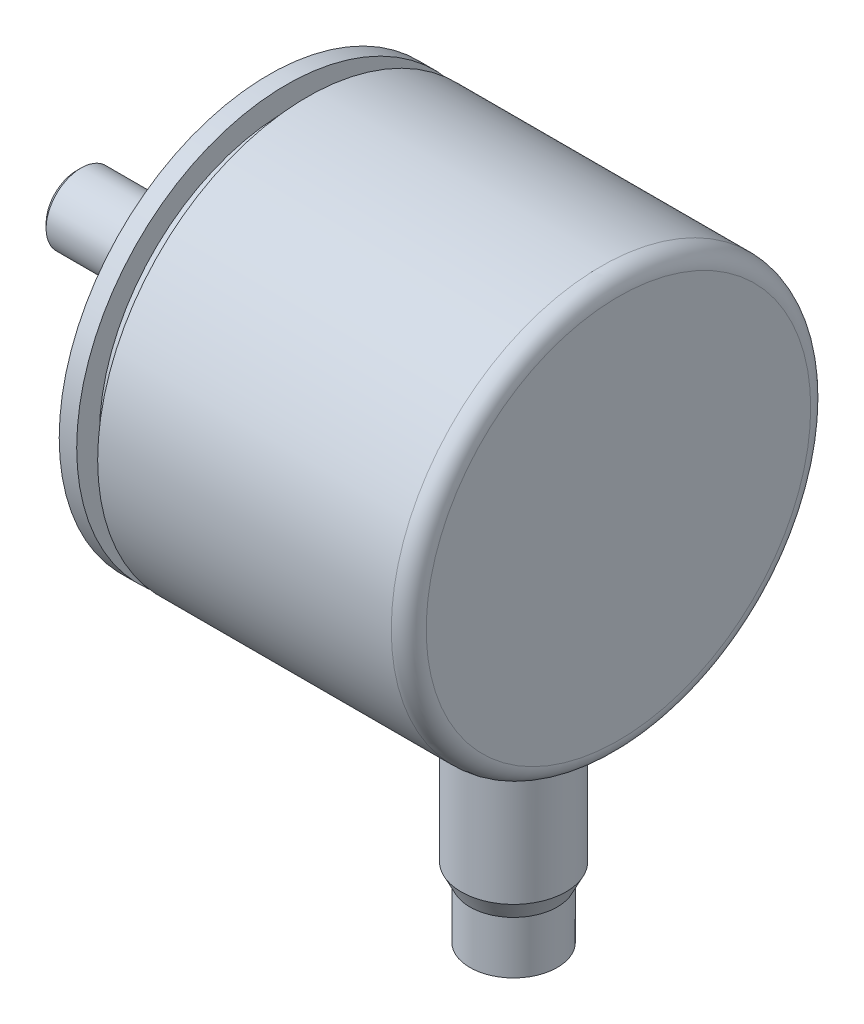
ISO-10303-21;
HEADER;
FILE_DESCRIPTION(('STEP AP214'),'2;1');
FILE_NAME('part.step','',(''),(''),'','','');
FILE_SCHEMA(('AUTOMOTIVE_DESIGN { 1 0 10303 214 1 1 1 1 }'));
ENDSEC;
DATA;
#1=APPLICATION_CONTEXT('core data for automotive mechanical design processes');
#2=APPLICATION_PROTOCOL_DEFINITION('international standard','automotive_design',2000,#1);
#3=PRODUCT_CONTEXT('',#1,'mechanical');
#4=PRODUCT('Part','Part','',(#3));
#5=PRODUCT_RELATED_PRODUCT_CATEGORY('part','',(#4));
#6=PRODUCT_DEFINITION_FORMATION('','',#4);
#7=PRODUCT_DEFINITION_CONTEXT('part definition',#1,'design');
#8=PRODUCT_DEFINITION('design','',#6,#7);
#9=PRODUCT_DEFINITION_SHAPE('','',#8);
#10=(LENGTH_UNIT() NAMED_UNIT(*) SI_UNIT(.MILLI.,.METRE.));
#11=(NAMED_UNIT(*) PLANE_ANGLE_UNIT() SI_UNIT($,.RADIAN.));
#12=(NAMED_UNIT(*) SI_UNIT($,.STERADIAN.) SOLID_ANGLE_UNIT());
#13=UNCERTAINTY_MEASURE_WITH_UNIT(LENGTH_MEASURE(1.E-05),#10,'distance_accuracy_value','');
#14=(GEOMETRIC_REPRESENTATION_CONTEXT(3) GLOBAL_UNCERTAINTY_ASSIGNED_CONTEXT((#13)) GLOBAL_UNIT_ASSIGNED_CONTEXT((#10,
#11,#12)) REPRESENTATION_CONTEXT('',''));
#15=CARTESIAN_POINT('',(0.,0.,0.));
#16=DIRECTION('',(0.,0.,1.));
#17=DIRECTION('',(1.,0.,0.));
#18=AXIS2_PLACEMENT_3D('',#15,#16,#17);
#19=CARTESIAN_POINT('',(25.,-13.,0.));
#20=DIRECTION('',(0.,1.,0.));
#21=DIRECTION('',(0.,0.,1.));
#22=AXIS2_PLACEMENT_3D('',#19,#20,#21);
#23=CYLINDRICAL_SURFACE('',#22,4.);
#24=CARTESIAN_POINT('',(25.,-11.3137084989848,4.));
#25=CARTESIAN_POINT('',(24.7821273006557,-11.3137077812174,4.00000103179085));
#26=CARTESIAN_POINT('',(24.5642608007056,-11.3200707716343,3.98213913474209));
#27=CARTESIAN_POINT('',(24.134982316023,-11.3447029632502,3.91140452675523));
#28=CARTESIAN_POINT('',(23.9235714005101,-11.3629741256876,3.85852604867359));
#29=CARTESIAN_POINT('',(23.5134924280108,-11.4091281475517,3.71982194273962));
#30=CARTESIAN_POINT('',(23.3148002822291,-11.4369921588529,3.63406088561298));
#31=CARTESIAN_POINT('',(22.9345598058082,-11.499164880413,3.43224651376552));
#32=CARTESIAN_POINT('',(22.7530152697855,-11.5334750121445,3.31618651544073));
#33=CARTESIAN_POINT('',(22.4051201506467,-11.6061795762989,3.05220458577151));
#34=CARTESIAN_POINT('',(22.2395382853131,-11.6446757937858,2.90329736551167));
#35=CARTESIAN_POINT('',(21.9351727951014,-11.7205545920401,2.57995066885758));
#36=CARTESIAN_POINT('',(21.7963934736705,-11.7579369931585,2.4055071002095));
#37=CARTESIAN_POINT('',(21.5460844106816,-11.828554676872,2.03041803186004));
#38=CARTESIAN_POINT('',(21.4353601175282,-11.8616563080642,1.8292076448981));
#39=CARTESIAN_POINT('',(21.24963365949,-11.9187834708393,1.40972489194989));
#40=CARTESIAN_POINT('',(21.1746218672924,-11.9428114481201,1.19145714274884));
#41=CARTESIAN_POINT('',(21.0650565814704,-11.9783630172763,0.752115269733972));
#42=CARTESIAN_POINT('',(21.029186214972,-11.9902925911024,0.531403019411868));
#43=CARTESIAN_POINT('',(20.9947348265574,-12.0017443287299,0.0867914992963533));
#44=CARTESIAN_POINT('',(20.9961441933904,-12.0012696905158,-0.13710693417559));
#45=CARTESIAN_POINT('',(21.0353770182641,-11.9882415847493,-0.572414060775262));
#46=CARTESIAN_POINT('',(21.071770113898,-11.9761625902047,-0.78396819436663));
#47=CARTESIAN_POINT('',(21.1775719239219,-11.9418786935893,-1.19777375528869));
#48=CARTESIAN_POINT('',(21.2469828759193,-11.9196731052473,-1.40002455111687));
#49=CARTESIAN_POINT('',(21.4176852692242,-11.867026811729,-1.7926098993679));
#50=CARTESIAN_POINT('',(21.5193837541861,-11.8364817009606,-1.98275288387538));
#51=CARTESIAN_POINT('',(21.7514388217946,-11.7703357215568,-2.34369730210929));
#52=CARTESIAN_POINT('',(21.8818033733105,-11.7347334480587,-2.51449333754137));
#53=CARTESIAN_POINT('',(22.1746975738388,-11.6602476739959,-2.84040346620523));
#54=CARTESIAN_POINT('',(22.3384526313659,-11.6212886067551,-2.99440062826109));
#55=CARTESIAN_POINT('',(22.6897949029065,-11.545893409956,-3.2731090383927));
#56=CARTESIAN_POINT('',(22.8773857829122,-11.5094576698246,-3.39781577312617));
#57=CARTESIAN_POINT('',(23.2746145024138,-11.4428210048445,-3.61594982014297));
#58=CARTESIAN_POINT('',(23.4845285252711,-11.4127163713899,-3.70890585448536));
#59=CARTESIAN_POINT('',(23.9182855768577,-11.3632660329754,-3.85777277307735));
#60=CARTESIAN_POINT('',(24.142122724825,-11.3439158194837,-3.91369918298997));
#61=CARTESIAN_POINT('',(24.5865534216463,-11.3191854526234,-3.98464512839009));
#62=CARTESIAN_POINT('',(24.8068376989946,-11.3132144127502,-4.00139638203053));
#63=CARTESIAN_POINT('',(25.2471045964564,-11.3142668823674,-3.99842175563887));
#64=CARTESIAN_POINT('',(25.467087264096,-11.3212880316726,-3.97870250090705));
#65=CARTESIAN_POINT('',(25.8926278628476,-11.346944723612,-3.90490260620924));
#66=CARTESIAN_POINT('',(26.0984217206034,-11.3651730176336,-3.85202557592273));
#67=CARTESIAN_POINT('',(26.4981744249567,-11.4107421468409,-3.71485545024187));
#68=CARTESIAN_POINT('',(26.6921311663631,-11.4380845973936,-3.63055678545369));
#69=CARTESIAN_POINT('',(27.069521683388,-11.4998751038315,-3.42989736295574));
#70=CARTESIAN_POINT('',(27.2524265705672,-11.5345210266251,-3.31260447343398));
#71=CARTESIAN_POINT('',(27.5965842095349,-11.6066307492386,-3.05034252223023));
#72=CARTESIAN_POINT('',(27.7578305546449,-11.6440953777518,-2.90536530199512));
#73=CARTESIAN_POINT('',(28.0621119363626,-11.719801545514,-2.5835668236013));
#74=CARTESIAN_POINT('',(28.2038975600754,-11.7579937431159,-2.4055490821866));
#75=CARTESIAN_POINT('',(28.4556645693922,-11.8290740645244,-2.02730916560102));
#76=CARTESIAN_POINT('',(28.5656470846497,-11.8619623767078,-1.82708777945821));
#77=CARTESIAN_POINT('',(28.7496804194469,-11.9185762324241,-1.41111944972918));
#78=CARTESIAN_POINT('',(28.8239651085923,-11.9423612001812,-1.19548449328478));
#79=CARTESIAN_POINT('',(28.9349109682404,-11.978344433511,-0.753833863384064));
#80=CARTESIAN_POINT('',(28.971585719522,-11.9905468813608,-0.527821967815556));
#81=CARTESIAN_POINT('',(29.0050483104226,-12.0016745294503,-0.0832613434401611));
#82=CARTESIAN_POINT('',(29.0036298157295,-12.0011968035776,0.135138895680077));
#83=CARTESIAN_POINT('',(28.9653707674144,-11.9884878607759,0.568444580000699));
#84=CARTESIAN_POINT('',(28.9285330873889,-11.976257597343,0.783350307276231));
#85=CARTESIAN_POINT('',(28.8216710616962,-11.9416365981765,1.20016847772824));
#86=CARTESIAN_POINT('',(28.7521831385883,-11.9194103344459,1.40223308365116));
#87=CARTESIAN_POINT('',(28.5824898756114,-11.8670864281798,1.79191340375918));
#88=CARTESIAN_POINT('',(28.4822789792119,-11.8369873619207,1.97952649656973));
#89=CARTESIAN_POINT('',(28.249721951592,-11.7706347531152,2.34253606523514));
#90=CARTESIAN_POINT('',(28.1163252584734,-11.7341948996771,2.51722500623043));
#91=CARTESIAN_POINT('',(27.8229704353752,-11.6597195516752,2.84232410508971));
#92=CARTESIAN_POINT('',(27.6630038309491,-11.6216835509239,2.99272648649837));
#93=CARTESIAN_POINT('',(27.3135625776522,-11.5465311930239,3.27096723533247));
#94=CARTESIAN_POINT('',(27.1231779560934,-11.5095091195452,3.3976918639916));
#95=CARTESIAN_POINT('',(26.7226622923889,-11.4424077329206,3.61725737320446));
#96=CARTESIAN_POINT('',(26.5125364278813,-11.41232660645,3.7101071072779));
#97=CARTESIAN_POINT('',(26.0881527039375,-11.3640533682606,3.85537531281666));
#98=CARTESIAN_POINT('',(25.8745109458985,-11.3453853142873,3.90943163659808));
#99=CARTESIAN_POINT('',(25.4405757981332,-11.3202153415807,3.98173728059707));
#100=CARTESIAN_POINT('',(25.2202847303572,-11.3137092246984,3.99999895678637));
#101=CARTESIAN_POINT('',(25.,-11.3137084989848,4.));
#102=B_SPLINE_CURVE_WITH_KNOTS('',3,(#24,#25,#26,#27,#28,#29,#30,#31,#32,#33,#34,#35,#36,#37,
#38,#39,#40,#41,#42,#43,#44,#45,#46,#47,#48,#49,#50,#51,#52,#53,#54,#55,#56,#57,#58,#59,#60,#61,
#62,#63,#64,#65,#66,#67,#68,#69,#70,#71,#72,#73,#74,#75,#76,#77,#78,#79,#80,#81,#82,#83,#84,#85,
#86,#87,#88,#89,#90,#91,#92,#93,#94,#95,#96,#97,#98,#99,#100,#101),.UNSPECIFIED.,.T.,.F.,(4,2,2,
2,2,2,2,2,2,2,2,2,2,2,2,2,2,2,2,2,2,2,2,2,2,2,2,2,2,2,2,2,2,2,2,2,2,2,4),(0.,0.652802339197421,
1.30571222006066,1.95734651000331,2.60912466474177,3.28405349710273,3.95909060687952,
4.65174024574629,5.34420305547157,6.01257275059737,6.68077013209309,7.32276019302276,
7.96479376756947,8.6152661944134,9.26591967496088,9.94720697455671,10.6285991844842,
11.3197055937222,12.0105220542646,12.6701716545776,13.3297014334894,13.966575830751,
14.6035631658778,15.2607543094286,15.9181394264851,16.6071523268437,17.2961407503013,
17.9805516476341,18.6647153201663,19.3167233871054,19.9686785603912,20.6102782416172,
21.2519940305297,21.9174207808253,22.5830601773053,23.2747561094458,23.9662711306747,
24.6265284865076,25.2865578876185),.UNSPECIFIED.);
#103=CARTESIAN_POINT('',(21.,-12.,0.));
#104=VERTEX_POINT('',#103);
#105=CARTESIAN_POINT('',(29.0000000000011,-12.0000000000004,0.));
#106=VERTEX_POINT('',#105);
#107=EDGE_CURVE('E137',#104,#106,#102,.T.);
#108=ORIENTED_EDGE('',*,*,#107,.T.);
#109=CARTESIAN_POINT('',(25.,-12.,0.));
#110=DIRECTION('',(0.,1.,0.));
#111=DIRECTION('',(0.,0.,1.));
#112=AXIS2_PLACEMENT_3D('',#109,#110,#111);
#113=CIRCLE('',#112,4.);
#114=EDGE_CURVE('E46',#106,#104,#113,.T.);
#115=ORIENTED_EDGE('',*,*,#114,.T.);
#116=EDGE_LOOP('',(#108,#115));
#117=FACE_BOUND('',#116,.T.);
#118=ADVANCED_FACE('F38',(#117),#23,.T.);
#119=CARTESIAN_POINT('',(0.,0.,0.));
#120=DIRECTION('',(-1.,0.,0.));
#121=DIRECTION('',(0.,0.,1.));
#122=AXIS2_PLACEMENT_3D('',#119,#120,#121);
#123=PLANE('',#122);
#124=CARTESIAN_POINT('',(0.,0.,0.));
#125=DIRECTION('',(-1.,0.,0.));
#126=DIRECTION('',(0.,0.,1.));
#127=AXIS2_PLACEMENT_3D('',#124,#125,#126);
#128=CIRCLE('',#127,1.75);
#129=CARTESIAN_POINT('',(0.,0.,1.75));
#130=VERTEX_POINT('',#129);
#131=EDGE_CURVE('E127',#130,#130,#128,.T.);
#132=ORIENTED_EDGE('',*,*,#131,.T.);
#133=EDGE_LOOP('',(#132));
#134=FACE_BOUND('',#133,.T.);
#135=ADVANCED_FACE('F171',(#134),#123,.T.);
#136=CARTESIAN_POINT('',(0.,0.,0.));
#137=DIRECTION('',(1.,0.,0.));
#138=DIRECTION('',(0.,0.,-1.));
#139=AXIS2_PLACEMENT_3D('',#136,#137,#138);
#140=CYLINDRICAL_SURFACE('',#139,2.);
#141=CARTESIAN_POINT('',(0.250000000000002,0.,0.));
#142=DIRECTION('',(-1.,0.,0.));
#143=DIRECTION('',(0.,0.,1.));
#144=AXIS2_PLACEMENT_3D('',#141,#142,#143);
#145=CIRCLE('',#144,2.);
#146=CARTESIAN_POINT('',(0.250000000000002,0.,2.));
#147=VERTEX_POINT('',#146);
#148=EDGE_CURVE('E124',#147,#147,#145,.F.);
#149=ORIENTED_EDGE('',*,*,#148,.T.);
#150=EDGE_LOOP('',(#149));
#151=FACE_BOUND('',#150,.T.);
#152=CARTESIAN_POINT('',(10.,0.,0.));
#153=DIRECTION('',(1.,0.,0.));
#154=DIRECTION('',(0.,0.,-1.));
#155=AXIS2_PLACEMENT_3D('',#152,#153,#154);
#156=CIRCLE('',#155,2.);
#157=CARTESIAN_POINT('',(10.,0.,-2.));
#158=VERTEX_POINT('',#157);
#159=EDGE_CURVE('E121',#158,#158,#156,.T.);
#160=ORIENTED_EDGE('',*,*,#159,.F.);
#161=EDGE_LOOP('',(#160));
#162=FACE_BOUND('',#161,.T.);
#163=ADVANCED_FACE('F176',(#151,#162),#140,.T.);
#164=CARTESIAN_POINT('',(10.,2.,0.));
#165=DIRECTION('',(-1.,0.,0.));
#166=DIRECTION('',(0.,0.,1.));
#167=AXIS2_PLACEMENT_3D('',#164,#165,#166);
#168=PLANE('',#167);
#169=ORIENTED_EDGE('',*,*,#159,.T.);
#170=EDGE_LOOP('',(#169));
#171=FACE_BOUND('',#170,.T.);
#172=CARTESIAN_POINT('',(10.,0.,0.));
#173=DIRECTION('',(1.,0.,0.));
#174=DIRECTION('',(0.,0.,-1.));
#175=AXIS2_PLACEMENT_3D('',#172,#173,#174);
#176=CIRCLE('',#175,6.);
#177=CARTESIAN_POINT('',(10.,0.,-6.));
#178=VERTEX_POINT('',#177);
#179=EDGE_CURVE('E118',#178,#178,#176,.T.);
#180=ORIENTED_EDGE('',*,*,#179,.F.);
#181=EDGE_LOOP('',(#180));
#182=FACE_BOUND('',#181,.T.);
#183=ADVANCED_FACE('F202',(#171,#182),#168,.T.);
#184=CARTESIAN_POINT('',(0.,0.,0.));
#185=DIRECTION('',(1.,0.,0.));
#186=DIRECTION('',(0.,0.,-1.));
#187=AXIS2_PLACEMENT_3D('',#184,#185,#186);
#188=CYLINDRICAL_SURFACE('',#187,6.);
#189=ORIENTED_EDGE('',*,*,#179,.T.);
#190=EDGE_LOOP('',(#189));
#191=FACE_BOUND('',#190,.T.);
#192=CARTESIAN_POINT('',(11.,0.,0.));
#193=DIRECTION('',(1.,0.,0.));
#194=DIRECTION('',(0.,0.,-1.));
#195=AXIS2_PLACEMENT_3D('',#192,#193,#194);
#196=CIRCLE('',#195,6.);
#197=CARTESIAN_POINT('',(11.,0.,-6.));
#198=VERTEX_POINT('',#197);
#199=EDGE_CURVE('E115',#198,#198,#196,.T.);
#200=ORIENTED_EDGE('',*,*,#199,.F.);
#201=EDGE_LOOP('',(#200));
#202=FACE_BOUND('',#201,.T.);
#203=ADVANCED_FACE('F206',(#191,#202),#188,.T.);
#204=CARTESIAN_POINT('',(11.,6.,0.));
#205=DIRECTION('',(-1.,0.,0.));
#206=DIRECTION('',(0.,0.,1.));
#207=AXIS2_PLACEMENT_3D('',#204,#205,#206);
#208=PLANE('',#207);
#209=CARTESIAN_POINT('',(11.,9.,0.));
#210=DIRECTION('',(-1.,0.,0.));
#211=DIRECTION('',(0.,0.,1.));
#212=AXIS2_PLACEMENT_3D('',#209,#210,#211);
#213=CIRCLE('',#212,1.24999999999999);
#214=CARTESIAN_POINT('',(11.,9.,1.24999999999999));
#215=VERTEX_POINT('',#214);
#216=EDGE_CURVE('E78',#215,#215,#213,.T.);
#217=ORIENTED_EDGE('',*,*,#216,.F.);
#218=EDGE_LOOP('',(#217));
#219=FACE_BOUND('',#218,.T.);
#220=CARTESIAN_POINT('',(11.,-4.50000000000003,7.79422863405993));
#221=DIRECTION('',(-1.,0.,0.));
#222=DIRECTION('',(0.,0.,1.));
#223=AXIS2_PLACEMENT_3D('',#220,#221,#222);
#224=CIRCLE('',#223,1.24999999999999);
#225=CARTESIAN_POINT('',(11.,-4.50000000000003,9.04422863405992));
#226=VERTEX_POINT('',#225);
#227=EDGE_CURVE('E77',#226,#226,#224,.T.);
#228=ORIENTED_EDGE('',*,*,#227,.F.);
#229=EDGE_LOOP('',(#228));
#230=FACE_BOUND('',#229,.T.);
#231=CARTESIAN_POINT('',(11.,-4.49999999999998,-7.79422863405996));
#232=DIRECTION('',(-1.,0.,0.));
#233=DIRECTION('',(0.,0.,1.));
#234=AXIS2_PLACEMENT_3D('',#231,#232,#233);
#235=CIRCLE('',#234,1.24999999999999);
#236=CARTESIAN_POINT('',(11.,-4.49999999999998,-6.54422863405997));
#237=VERTEX_POINT('',#236);
#238=EDGE_CURVE('E88',#237,#237,#235,.T.);
#239=ORIENTED_EDGE('',*,*,#238,.F.);
#240=EDGE_LOOP('',(#239));
#241=FACE_BOUND('',#240,.T.);
#242=ORIENTED_EDGE('',*,*,#199,.T.);
#243=EDGE_LOOP('',(#242));
#244=FACE_BOUND('',#243,.T.);
#245=CARTESIAN_POINT('',(11.,0.,0.));
#246=DIRECTION('',(1.,0.,0.));
#247=DIRECTION('',(0.,0.,-1.));
#248=AXIS2_PLACEMENT_3D('',#245,#246,#247);
#249=CIRCLE('',#248,12.);
#250=CARTESIAN_POINT('',(11.,0.,-12.));
#251=VERTEX_POINT('',#250);
#252=EDGE_CURVE('E112',#251,#251,#249,.T.);
#253=ORIENTED_EDGE('',*,*,#252,.F.);
#254=EDGE_LOOP('',(#253));
#255=FACE_BOUND('',#254,.T.);
#256=ADVANCED_FACE('F210',(#219,#230,#241,#244,#255),#208,.T.);
#257=CARTESIAN_POINT('',(0.,0.,0.));
#258=DIRECTION('',(1.,0.,0.));
#259=DIRECTION('',(0.,0.,-1.));
#260=AXIS2_PLACEMENT_3D('',#257,#258,#259);
#261=CYLINDRICAL_SURFACE('',#260,12.);
#262=ORIENTED_EDGE('',*,*,#252,.T.);
#263=EDGE_LOOP('',(#262));
#264=FACE_BOUND('',#263,.T.);
#265=CARTESIAN_POINT('',(12.,0.,0.));
#266=DIRECTION('',(1.,0.,0.));
#267=DIRECTION('',(0.,0.,-1.));
#268=AXIS2_PLACEMENT_3D('',#265,#266,#267);
#269=CIRCLE('',#268,12.);
#270=CARTESIAN_POINT('',(12.,0.,-12.));
#271=VERTEX_POINT('',#270);
#272=EDGE_CURVE('E109',#271,#271,#269,.T.);
#273=ORIENTED_EDGE('',*,*,#272,.F.);
#274=EDGE_LOOP('',(#273));
#275=FACE_BOUND('',#274,.T.);
#276=ADVANCED_FACE('F214',(#264,#275),#261,.T.);
#277=CARTESIAN_POINT('',(12.,12.,0.));
#278=DIRECTION('',(1.,0.,0.));
#279=DIRECTION('',(0.,0.,-1.));
#280=AXIS2_PLACEMENT_3D('',#277,#278,#279);
#281=PLANE('',#280);
#282=ORIENTED_EDGE('',*,*,#272,.T.);
#283=EDGE_LOOP('',(#282));
#284=FACE_BOUND('',#283,.T.);
#285=CARTESIAN_POINT('',(12.,0.,0.));
#286=DIRECTION('',(1.,0.,0.));
#287=DIRECTION('',(0.,0.,-1.));
#288=AXIS2_PLACEMENT_3D('',#285,#286,#287);
#289=CIRCLE('',#288,10.7);
#290=CARTESIAN_POINT('',(12.,0.,-10.7));
#291=VERTEX_POINT('',#290);
#292=EDGE_CURVE('E106',#291,#291,#289,.T.);
#293=ORIENTED_EDGE('',*,*,#292,.F.);
#294=EDGE_LOOP('',(#293));
#295=FACE_BOUND('',#294,.T.);
#296=ADVANCED_FACE('F218',(#284,#295),#281,.T.);
#297=CARTESIAN_POINT('',(0.,0.,0.));
#298=DIRECTION('',(1.,0.,0.));
#299=DIRECTION('',(0.,0.,-1.));
#300=AXIS2_PLACEMENT_3D('',#297,#298,#299);
#301=CYLINDRICAL_SURFACE('',#300,10.7);
#302=ORIENTED_EDGE('',*,*,#292,.T.);
#303=EDGE_LOOP('',(#302));
#304=FACE_BOUND('',#303,.T.);
#305=CARTESIAN_POINT('',(13.2,0.,0.));
#306=DIRECTION('',(1.,0.,0.));
#307=DIRECTION('',(0.,0.,-1.));
#308=AXIS2_PLACEMENT_3D('',#305,#306,#307);
#309=CIRCLE('',#308,10.7);
#310=CARTESIAN_POINT('',(13.2,0.,-10.7));
#311=VERTEX_POINT('',#310);
#312=EDGE_CURVE('E103',#311,#311,#309,.T.);
#313=ORIENTED_EDGE('',*,*,#312,.F.);
#314=EDGE_LOOP('',(#313));
#315=FACE_BOUND('',#314,.T.);
#316=ADVANCED_FACE('F222',(#304,#315),#301,.T.);
#317=CARTESIAN_POINT('',(13.2,10.7,0.));
#318=DIRECTION('',(-1.,0.,0.));
#319=DIRECTION('',(0.,0.,1.));
#320=AXIS2_PLACEMENT_3D('',#317,#318,#319);
#321=PLANE('',#320);
#322=ORIENTED_EDGE('',*,*,#312,.T.);
#323=EDGE_LOOP('',(#322));
#324=FACE_BOUND('',#323,.T.);
#325=CARTESIAN_POINT('',(13.2,0.,0.));
#326=DIRECTION('',(1.,0.,0.));
#327=DIRECTION('',(0.,0.,-1.));
#328=AXIS2_PLACEMENT_3D('',#325,#326,#327);
#329=CIRCLE('',#328,12.);
#330=CARTESIAN_POINT('',(13.2,0.,-12.));
#331=VERTEX_POINT('',#330);
#332=EDGE_CURVE('E98',#331,#331,#329,.T.);
#333=ORIENTED_EDGE('',*,*,#332,.F.);
#334=EDGE_LOOP('',(#333));
#335=FACE_BOUND('',#334,.T.);
#336=ADVANCED_FACE('F168',(#324,#335),#321,.T.);
#337=CARTESIAN_POINT('',(0.,0.,0.));
#338=DIRECTION('',(1.,0.,0.));
#339=DIRECTION('',(0.,0.,-1.));
#340=AXIS2_PLACEMENT_3D('',#337,#338,#339);
#341=CYLINDRICAL_SURFACE('',#340,12.);
#342=ORIENTED_EDGE('',*,*,#107,.F.);
#343=EDGE_CURVE('E136',#106,#104,#102,.T.);
#344=ORIENTED_EDGE('',*,*,#343,.F.);
#345=EDGE_LOOP('',(#342,#344));
#346=FACE_BOUND('',#345,.T.);
#347=CARTESIAN_POINT('',(30.,0.,0.));
#348=DIRECTION('',(1.,0.,0.));
#349=DIRECTION('',(0.,0.,-1.));
#350=AXIS2_PLACEMENT_3D('',#347,#348,#349);
#351=CIRCLE('',#350,12.);
#352=CARTESIAN_POINT('',(30.,0.,-12.));
#353=VERTEX_POINT('',#352);
#354=EDGE_CURVE('E133',#353,#353,#351,.F.);
#355=ORIENTED_EDGE('',*,*,#354,.T.);
#356=EDGE_LOOP('',(#355));
#357=FACE_BOUND('',#356,.T.);
#358=ORIENTED_EDGE('',*,*,#332,.T.);
#359=EDGE_LOOP('',(#358));
#360=FACE_BOUND('',#359,.T.);
#361=ADVANCED_FACE('F147',(#346,#357,#360),#341,.T.);
#362=CARTESIAN_POINT('',(31.,12.,0.));
#363=DIRECTION('',(1.,0.,0.));
#364=DIRECTION('',(0.,0.,-1.));
#365=AXIS2_PLACEMENT_3D('',#362,#363,#364);
#366=PLANE('',#365);
#367=CARTESIAN_POINT('',(31.,0.,0.));
#368=DIRECTION('',(1.,0.,0.));
#369=DIRECTION('',(0.,0.,-1.));
#370=AXIS2_PLACEMENT_3D('',#367,#368,#369);
#371=CIRCLE('',#370,11.);
#372=CARTESIAN_POINT('',(31.,0.,-11.));
#373=VERTEX_POINT('',#372);
#374=EDGE_CURVE('E130',#373,#373,#371,.T.);
#375=ORIENTED_EDGE('',*,*,#374,.T.);
#376=EDGE_LOOP('',(#375));
#377=FACE_BOUND('',#376,.T.);
#378=ADVANCED_FACE('F158',(#377),#366,.T.);
#379=CARTESIAN_POINT('',(0.250000000000002,0.,0.));
#380=DIRECTION('',(1.,0.,0.));
#381=DIRECTION('',(0.,0.,-1.));
#382=AXIS2_PLACEMENT_3D('',#379,#380,#381);
#383=CONICAL_SURFACE('',#382,2.,0.785398163397448);
#384=ORIENTED_EDGE('',*,*,#131,.F.);
#385=EDGE_LOOP('',(#384));
#386=FACE_BOUND('',#385,.T.);
#387=ORIENTED_EDGE('',*,*,#148,.F.);
#388=EDGE_LOOP('',(#387));
#389=FACE_BOUND('',#388,.T.);
#390=ADVANCED_FACE('F160',(#386,#389),#383,.T.);
#391=CARTESIAN_POINT('',(30.,0.,0.));
#392=DIRECTION('',(1.,0.,0.));
#393=DIRECTION('',(0.,0.,-1.));
#394=AXIS2_PLACEMENT_3D('',#391,#392,#393);
#395=TOROIDAL_SURFACE('',#394,11.,1.);
#396=ORIENTED_EDGE('',*,*,#354,.F.);
#397=EDGE_LOOP('',(#396));
#398=FACE_BOUND('',#397,.T.);
#399=ORIENTED_EDGE('',*,*,#374,.F.);
#400=EDGE_LOOP('',(#399));
#401=FACE_BOUND('',#400,.T.);
#402=ADVANCED_FACE('F156',(#398,#401),#395,.T.);
#403=ORIENTED_EDGE('',*,*,#343,.T.);
#404=CARTESIAN_POINT('',(25.,-12.,0.));
#405=DIRECTION('',(0.,1.,0.));
#406=DIRECTION('',(0.,0.,1.));
#407=AXIS2_PLACEMENT_3D('',#404,#405,#406);
#408=CIRCLE('',#407,4.);
#409=EDGE_CURVE('E52',#104,#106,#408,.T.);
#410=ORIENTED_EDGE('',*,*,#409,.T.);
#411=EDGE_LOOP('',(#403,#410));
#412=FACE_BOUND('',#411,.T.);
#413=ADVANCED_FACE('F151',(#412),#23,.T.);
#414=CARTESIAN_POINT('',(25.,-21.,0.));
#415=DIRECTION('',(0.,1.,0.));
#416=DIRECTION('',(0.,0.,1.));
#417=AXIS2_PLACEMENT_3D('',#414,#415,#416);
#418=CYLINDRICAL_SURFACE('',#417,3.);
#419=CARTESIAN_POINT('',(25.,-20.,0.));
#420=DIRECTION('',(0.,-1.,0.));
#421=DIRECTION('',(0.,0.,-1.));
#422=AXIS2_PLACEMENT_3D('',#419,#420,#421);
#423=CIRCLE('',#422,3.);
#424=CARTESIAN_POINT('',(25.,-20.,-3.));
#425=VERTEX_POINT('',#424);
#426=EDGE_CURVE('E11',#425,#425,#423,.F.);
#427=ORIENTED_EDGE('',*,*,#426,.T.);
#428=EDGE_LOOP('',(#427));
#429=FACE_BOUND('',#428,.T.);
#430=CARTESIAN_POINT('',(25.,-13.,0.));
#431=DIRECTION('',(0.,1.,0.));
#432=DIRECTION('',(0.,0.,1.));
#433=AXIS2_PLACEMENT_3D('',#430,#431,#432);
#434=CIRCLE('',#433,3.);
#435=CARTESIAN_POINT('',(25.,-13.,3.));
#436=VERTEX_POINT('',#435);
#437=EDGE_CURVE('E145',#436,#436,#434,.F.);
#438=ORIENTED_EDGE('',*,*,#437,.T.);
#439=EDGE_LOOP('',(#438));
#440=FACE_BOUND('',#439,.T.);
#441=ADVANCED_FACE('F155',(#429,#440),#418,.T.);
#442=CARTESIAN_POINT('',(25.,-24.,0.));
#443=DIRECTION('',(0.,1.,0.));
#444=DIRECTION('',(0.,0.,1.));
#445=AXIS2_PLACEMENT_3D('',#442,#443,#444);
#446=CYLINDRICAL_SURFACE('',#445,2.5);
#447=CARTESIAN_POINT('',(25.,-24.,0.));
#448=DIRECTION('',(0.,-1.,0.));
#449=DIRECTION('',(0.,0.,-1.));
#450=AXIS2_PLACEMENT_3D('',#447,#448,#449);
#451=CIRCLE('',#450,2.5);
#452=CARTESIAN_POINT('',(25.,-24.,-2.5));
#453=VERTEX_POINT('',#452);
#454=EDGE_CURVE('E95',#453,#453,#451,.T.);
#455=ORIENTED_EDGE('',*,*,#454,.F.);
#456=EDGE_LOOP('',(#455));
#457=FACE_BOUND('',#456,.T.);
#458=CARTESIAN_POINT('',(25.,-21.,0.));
#459=DIRECTION('',(0.,-1.,0.));
#460=DIRECTION('',(0.,0.,-1.));
#461=AXIS2_PLACEMENT_3D('',#458,#459,#460);
#462=CIRCLE('',#461,2.5);
#463=CARTESIAN_POINT('',(25.,-21.,-2.5));
#464=VERTEX_POINT('',#463);
#465=EDGE_CURVE('E94',#464,#464,#462,.T.);
#466=ORIENTED_EDGE('',*,*,#465,.T.);
#467=EDGE_LOOP('',(#466));
#468=FACE_BOUND('',#467,.T.);
#469=ADVANCED_FACE('F193',(#457,#468),#446,.T.);
#470=CARTESIAN_POINT('',(25.,-24.,0.));
#471=DIRECTION('',(0.,-1.,0.));
#472=DIRECTION('',(0.,0.,-1.));
#473=AXIS2_PLACEMENT_3D('',#470,#471,#472);
#474=PLANE('',#473);
#475=ORIENTED_EDGE('',*,*,#454,.T.);
#476=EDGE_LOOP('',(#475));
#477=FACE_BOUND('',#476,.T.);
#478=ADVANCED_FACE('F186',(#477),#474,.T.);
#479=CARTESIAN_POINT('',(25.,-12.,0.));
#480=DIRECTION('',(0.,1.,0.));
#481=DIRECTION('',(0.,0.,1.));
#482=AXIS2_PLACEMENT_3D('',#479,#480,#481);
#483=CONICAL_SURFACE('',#482,4.,0.785398163397452);
#484=ORIENTED_EDGE('',*,*,#437,.F.);
#485=EDGE_LOOP('',(#484));
#486=FACE_BOUND('',#485,.T.);
#487=ORIENTED_EDGE('',*,*,#409,.F.);
#488=ORIENTED_EDGE('',*,*,#114,.F.);
#489=EDGE_LOOP('',(#487,#488));
#490=FACE_BOUND('',#489,.T.);
#491=ADVANCED_FACE('F180',(#486,#490),#483,.T.);
#492=CARTESIAN_POINT('',(25.,-21.,0.));
#493=DIRECTION('',(0.,1.,0.));
#494=DIRECTION('',(0.,0.,1.));
#495=AXIS2_PLACEMENT_3D('',#492,#493,#494);
#496=CONICAL_SURFACE('',#495,2.49999999999999,0.463647609000807);
#497=ORIENTED_EDGE('',*,*,#426,.F.);
#498=EDGE_LOOP('',(#497));
#499=FACE_BOUND('',#498,.T.);
#500=ORIENTED_EDGE('',*,*,#465,.F.);
#501=EDGE_LOOP('',(#500));
#502=FACE_BOUND('',#501,.T.);
#503=ADVANCED_FACE('F40',(#499,#502),#496,.T.);
#504=CARTESIAN_POINT('',(16.5,-4.49999999999998,-7.79422863405996));
#505=DIRECTION('',(-1.,0.,0.));
#506=DIRECTION('',(0.,0.,1.));
#507=AXIS2_PLACEMENT_3D('',#504,#505,#506);
#508=CONICAL_SURFACE('',#507,1.25,1.02974425867665);
#509=CARTESIAN_POINT('',(17.2510757737845,-4.49999999999998,-7.79422863405996));
#510=VERTEX_POINT('',#509);
#511=VERTEX_LOOP('',#510);
#512=FACE_BOUND('',#511,.T.);
#513=CARTESIAN_POINT('',(16.5,-4.49999999999998,-7.79422863405996));
#514=DIRECTION('',(-1.,0.,0.));
#515=DIRECTION('',(0.,0.,1.));
#516=AXIS2_PLACEMENT_3D('',#513,#514,#515);
#517=CIRCLE('',#516,1.25);
#518=CARTESIAN_POINT('',(16.5,-4.49999999999998,-6.54422863405996));
#519=VERTEX_POINT('',#518);
#520=EDGE_CURVE('E91',#519,#519,#517,.T.);
#521=ORIENTED_EDGE('',*,*,#520,.T.);
#522=EDGE_LOOP('',(#521));
#523=FACE_BOUND('',#522,.T.);
#524=ADVANCED_FACE('F191',(#512,#523),#508,.F.);
#525=CARTESIAN_POINT('',(11.,-4.49999999999998,-7.79422863405996));
#526=DIRECTION('',(-1.,0.,0.));
#527=DIRECTION('',(0.,0.,1.));
#528=AXIS2_PLACEMENT_3D('',#525,#526,#527);
#529=CYLINDRICAL_SURFACE('',#528,1.24999999999999);
#530=ORIENTED_EDGE('',*,*,#520,.F.);
#531=EDGE_LOOP('',(#530));
#532=FACE_BOUND('',#531,.T.);
#533=ORIENTED_EDGE('',*,*,#238,.T.);
#534=EDGE_LOOP('',(#533));
#535=FACE_BOUND('',#534,.T.);
#536=ADVANCED_FACE('F290',(#532,#535),#529,.F.);
#537=CARTESIAN_POINT('',(16.5,-4.50000000000003,7.79422863405993));
#538=DIRECTION('',(-1.,0.,0.));
#539=DIRECTION('',(0.,0.,1.));
#540=AXIS2_PLACEMENT_3D('',#537,#538,#539);
#541=CONICAL_SURFACE('',#540,1.25,1.02974425867665);
#542=CARTESIAN_POINT('',(17.2510757737845,-4.50000000000004,7.79422863405993));
#543=VERTEX_POINT('',#542);
#544=VERTEX_LOOP('',#543);
#545=FACE_BOUND('',#544,.T.);
#546=CARTESIAN_POINT('',(16.5,-4.50000000000003,7.79422863405993));
#547=DIRECTION('',(-1.,0.,0.));
#548=DIRECTION('',(0.,0.,1.));
#549=AXIS2_PLACEMENT_3D('',#546,#547,#548);
#550=CIRCLE('',#549,1.25);
#551=CARTESIAN_POINT('',(16.5,-4.50000000000003,9.04422863405992));
#552=VERTEX_POINT('',#551);
#553=EDGE_CURVE('E81',#552,#552,#550,.T.);
#554=ORIENTED_EDGE('',*,*,#553,.T.);
#555=EDGE_LOOP('',(#554));
#556=FACE_BOUND('',#555,.T.);
#557=ADVANCED_FACE('F301',(#545,#556),#541,.F.);
#558=CARTESIAN_POINT('',(11.,-4.50000000000003,7.79422863405993));
#559=DIRECTION('',(-1.,0.,0.));
#560=DIRECTION('',(0.,0.,1.));
#561=AXIS2_PLACEMENT_3D('',#558,#559,#560);
#562=CYLINDRICAL_SURFACE('',#561,1.24999999999999);
#563=ORIENTED_EDGE('',*,*,#553,.F.);
#564=EDGE_LOOP('',(#563));
#565=FACE_BOUND('',#564,.T.);
#566=ORIENTED_EDGE('',*,*,#227,.T.);
#567=EDGE_LOOP('',(#566));
#568=FACE_BOUND('',#567,.T.);
#569=ADVANCED_FACE('F71',(#565,#568),#562,.F.);
#570=CARTESIAN_POINT('',(16.5,9.,0.));
#571=DIRECTION('',(-1.,0.,0.));
#572=DIRECTION('',(0.,0.,1.));
#573=AXIS2_PLACEMENT_3D('',#570,#571,#572);
#574=CONICAL_SURFACE('',#573,1.25,1.02974425867665);
#575=CARTESIAN_POINT('',(17.2510757737845,9.,0.));
#576=VERTEX_POINT('',#575);
#577=VERTEX_LOOP('',#576);
#578=FACE_BOUND('',#577,.T.);
#579=CARTESIAN_POINT('',(16.5,9.,0.));
#580=DIRECTION('',(-1.,0.,0.));
#581=DIRECTION('',(0.,0.,1.));
#582=AXIS2_PLACEMENT_3D('',#579,#580,#581);
#583=CIRCLE('',#582,1.25);
#584=CARTESIAN_POINT('',(16.5,9.,1.25));
#585=VERTEX_POINT('',#584);
#586=EDGE_CURVE('E75',#585,#585,#583,.T.);
#587=ORIENTED_EDGE('',*,*,#586,.T.);
#588=EDGE_LOOP('',(#587));
#589=FACE_BOUND('',#588,.T.);
#590=ADVANCED_FACE('F67',(#578,#589),#574,.F.);
#591=CARTESIAN_POINT('',(11.,9.,0.));
#592=DIRECTION('',(-1.,0.,0.));
#593=DIRECTION('',(0.,0.,1.));
#594=AXIS2_PLACEMENT_3D('',#591,#592,#593);
#595=CYLINDRICAL_SURFACE('',#594,1.24999999999999);
#596=ORIENTED_EDGE('',*,*,#586,.F.);
#597=EDGE_LOOP('',(#596));
#598=FACE_BOUND('',#597,.T.);
#599=ORIENTED_EDGE('',*,*,#216,.T.);
#600=EDGE_LOOP('',(#599));
#601=FACE_BOUND('',#600,.T.);
#602=ADVANCED_FACE('F70',(#598,#601),#595,.F.);
#603=CLOSED_SHELL('',(#118,#135,#163,#183,#203,#256,#276,#296,#316,#336,#361,#378,#390,#402,
#413,#441,#469,#478,#491,#503,#524,#536,#557,#569,#590,#602));
#604=MANIFOLD_SOLID_BREP('B2',#603);
#605=ADVANCED_BREP_SHAPE_REPRESENTATION('',(#18,#604),#14);
#606=SHAPE_DEFINITION_REPRESENTATION(#9,#605);
ENDSEC;
END-ISO-10303-21;
